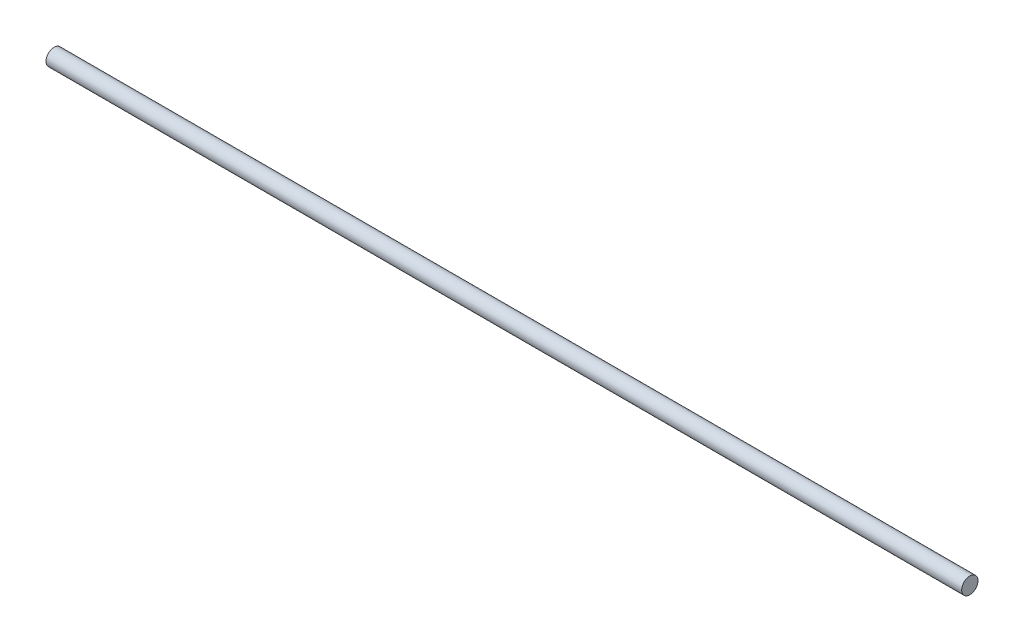
ISO-10303-21;
HEADER;
FILE_DESCRIPTION(('STEP AP214'),'2;1');
FILE_NAME('part.step','',(''),(''),'','','');
FILE_SCHEMA(('AUTOMOTIVE_DESIGN { 1 0 10303 214 1 1 1 1 }'));
ENDSEC;
DATA;
#1=APPLICATION_CONTEXT('core data for automotive mechanical design processes');
#2=APPLICATION_PROTOCOL_DEFINITION('international standard','automotive_design',2000,#1);
#3=PRODUCT_CONTEXT('',#1,'mechanical');
#4=PRODUCT('Part','Part','',(#3));
#5=PRODUCT_RELATED_PRODUCT_CATEGORY('part','',(#4));
#6=PRODUCT_DEFINITION_FORMATION('','',#4);
#7=PRODUCT_DEFINITION_CONTEXT('part definition',#1,'design');
#8=PRODUCT_DEFINITION('design','',#6,#7);
#9=PRODUCT_DEFINITION_SHAPE('','',#8);
#10=(LENGTH_UNIT() NAMED_UNIT(*) SI_UNIT(.MILLI.,.METRE.));
#11=(NAMED_UNIT(*) PLANE_ANGLE_UNIT() SI_UNIT($,.RADIAN.));
#12=(NAMED_UNIT(*) SI_UNIT($,.STERADIAN.) SOLID_ANGLE_UNIT());
#13=UNCERTAINTY_MEASURE_WITH_UNIT(LENGTH_MEASURE(1.E-05),#10,'distance_accuracy_value','');
#14=(GEOMETRIC_REPRESENTATION_CONTEXT(3) GLOBAL_UNCERTAINTY_ASSIGNED_CONTEXT((#13)) GLOBAL_UNIT_ASSIGNED_CONTEXT((#10,
#11,#12)) REPRESENTATION_CONTEXT('',''));
#15=CARTESIAN_POINT('',(0.,0.,0.));
#16=DIRECTION('',(0.,0.,1.));
#17=DIRECTION('',(1.,0.,0.));
#18=AXIS2_PLACEMENT_3D('',#15,#16,#17);
#19=CARTESIAN_POINT('',(356.,0.,0.));
#20=DIRECTION('',(-1.,0.,0.));
#21=DIRECTION('',(0.,0.,1.));
#22=AXIS2_PLACEMENT_3D('',#19,#20,#21);
#23=CYLINDRICAL_SURFACE('',#22,3.175);
#24=CARTESIAN_POINT('',(356.,0.,0.));
#25=DIRECTION('',(1.,0.,0.));
#26=DIRECTION('',(0.,0.,-1.));
#27=AXIS2_PLACEMENT_3D('',#24,#25,#26);
#28=CIRCLE('',#27,3.175);
#29=CARTESIAN_POINT('',(356.,0.,-3.175));
#30=VERTEX_POINT('',#29);
#31=EDGE_CURVE('E10',#30,#30,#28,.T.);
#32=ORIENTED_EDGE('',*,*,#31,.F.);
#33=EDGE_LOOP('',(#32));
#34=FACE_BOUND('',#33,.T.);
#35=CARTESIAN_POINT('',(0.,0.,0.));
#36=DIRECTION('',(1.,0.,0.));
#37=DIRECTION('',(0.,0.,-1.));
#38=AXIS2_PLACEMENT_3D('',#35,#36,#37);
#39=CIRCLE('',#38,3.175);
#40=CARTESIAN_POINT('',(0.,0.,-3.175));
#41=VERTEX_POINT('',#40);
#42=EDGE_CURVE('E46',#41,#41,#39,.T.);
#43=ORIENTED_EDGE('',*,*,#42,.T.);
#44=EDGE_LOOP('',(#43));
#45=FACE_BOUND('',#44,.T.);
#46=ADVANCED_FACE('F43',(#34,#45),#23,.T.);
#47=CARTESIAN_POINT('',(356.,0.,0.));
#48=DIRECTION('',(1.,0.,0.));
#49=DIRECTION('',(0.,0.,-1.));
#50=AXIS2_PLACEMENT_3D('',#47,#48,#49);
#51=PLANE('',#50);
#52=ORIENTED_EDGE('',*,*,#31,.T.);
#53=EDGE_LOOP('',(#52));
#54=FACE_BOUND('',#53,.T.);
#55=ADVANCED_FACE('F58',(#54),#51,.T.);
#56=CARTESIAN_POINT('',(0.,0.,0.));
#57=DIRECTION('',(1.,0.,0.));
#58=DIRECTION('',(0.,0.,-1.));
#59=AXIS2_PLACEMENT_3D('',#56,#57,#58);
#60=PLANE('',#59);
#61=ORIENTED_EDGE('',*,*,#42,.F.);
#62=EDGE_LOOP('',(#61));
#63=FACE_BOUND('',#62,.T.);
#64=ADVANCED_FACE('F59',(#63),#60,.F.);
#65=CLOSED_SHELL('',(#46,#55,#64));
#66=MANIFOLD_SOLID_BREP('B2',#65);
#67=ADVANCED_BREP_SHAPE_REPRESENTATION('',(#18,#66),#14);
#68=SHAPE_DEFINITION_REPRESENTATION(#9,#67);
ENDSEC;
END-ISO-10303-21;
